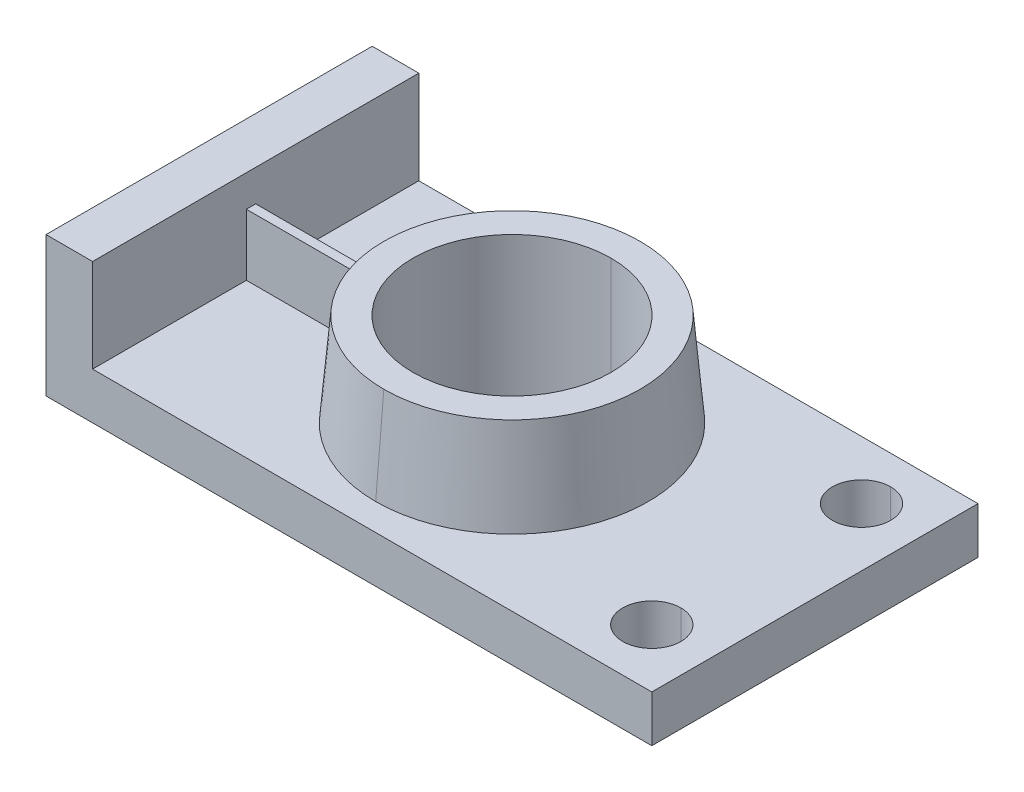
ISO-10303-21;
HEADER;
FILE_DESCRIPTION(('STEP AP214'),'2;1');
FILE_NAME('part.step','',(''),(''),'','','');
FILE_SCHEMA(('AUTOMOTIVE_DESIGN { 1 0 10303 214 1 1 1 1 }'));
ENDSEC;
DATA;
#1=APPLICATION_CONTEXT('core data for automotive mechanical design processes');
#2=APPLICATION_PROTOCOL_DEFINITION('international standard','automotive_design',2000,#1);
#3=PRODUCT_CONTEXT('',#1,'mechanical');
#4=PRODUCT('Part','Part','',(#3));
#5=PRODUCT_RELATED_PRODUCT_CATEGORY('part','',(#4));
#6=PRODUCT_DEFINITION_FORMATION('','',#4);
#7=PRODUCT_DEFINITION_CONTEXT('part definition',#1,'design');
#8=PRODUCT_DEFINITION('design','',#6,#7);
#9=PRODUCT_DEFINITION_SHAPE('','',#8);
#10=(LENGTH_UNIT() NAMED_UNIT(*) SI_UNIT(.MILLI.,.METRE.));
#11=(NAMED_UNIT(*) PLANE_ANGLE_UNIT() SI_UNIT($,.RADIAN.));
#12=(NAMED_UNIT(*) SI_UNIT($,.STERADIAN.) SOLID_ANGLE_UNIT());
#13=UNCERTAINTY_MEASURE_WITH_UNIT(LENGTH_MEASURE(1.E-05),#10,'distance_accuracy_value','');
#14=(GEOMETRIC_REPRESENTATION_CONTEXT(3) GLOBAL_UNCERTAINTY_ASSIGNED_CONTEXT((#13)) GLOBAL_UNIT_ASSIGNED_CONTEXT((#10,
#11,#12)) REPRESENTATION_CONTEXT('',''));
#15=CARTESIAN_POINT('',(0.,0.,0.));
#16=DIRECTION('',(0.,0.,1.));
#17=DIRECTION('',(1.,0.,0.));
#18=AXIS2_PLACEMENT_3D('',#15,#16,#17);
#19=CARTESIAN_POINT('',(149.225,0.,-73.025));
#20=DIRECTION('',(0.,1.,0.));
#21=DIRECTION('',(0.,0.,1.));
#22=AXIS2_PLACEMENT_3D('',#19,#20,#21);
#23=CYLINDRICAL_SURFACE('',#22,7.9375);
#24=DIRECTION('',(0.,1.,0.));
#25=VECTOR('',#24,1.);
#26=CARTESIAN_POINT('',(149.225,0.,-80.9625));
#27=LINE('',#26,#25);
#28=CARTESIAN_POINT('',(149.225,0.,-80.9625));
#29=VERTEX_POINT('',#28);
#30=CARTESIAN_POINT('',(149.225,12.7,-80.9625));
#31=VERTEX_POINT('',#30);
#32=EDGE_CURVE('E47',#29,#31,#27,.T.);
#33=ORIENTED_EDGE('',*,*,#32,.F.);
#34=CARTESIAN_POINT('',(149.225,0.,-73.025));
#35=DIRECTION('',(0.,1.,0.));
#36=DIRECTION('',(0.,0.,1.));
#37=AXIS2_PLACEMENT_3D('',#34,#35,#36);
#38=CIRCLE('',#37,7.9375);
#39=CARTESIAN_POINT('',(149.225,0.,-65.0875));
#40=VERTEX_POINT('',#39);
#41=EDGE_CURVE('E279',#40,#29,#38,.T.);
#42=ORIENTED_EDGE('',*,*,#41,.F.);
#43=DIRECTION('',(0.,1.,0.));
#44=VECTOR('',#43,1.);
#45=CARTESIAN_POINT('',(149.225,0.,-65.0875));
#46=LINE('',#45,#44);
#47=CARTESIAN_POINT('',(149.225,12.7,-65.0875));
#48=VERTEX_POINT('',#47);
#49=EDGE_CURVE('E262',#40,#48,#46,.T.);
#50=ORIENTED_EDGE('',*,*,#49,.T.);
#51=CARTESIAN_POINT('',(149.225,12.7,-73.025));
#52=DIRECTION('',(0.,1.,0.));
#53=DIRECTION('',(0.,0.,1.));
#54=AXIS2_PLACEMENT_3D('',#51,#52,#53);
#55=CIRCLE('',#54,7.9375);
#56=EDGE_CURVE('E311',#48,#31,#55,.T.);
#57=ORIENTED_EDGE('',*,*,#56,.T.);
#58=EDGE_LOOP('',(#33,#42,#50,#57));
#59=FACE_BOUND('',#58,.T.);
#60=ADVANCED_FACE('F43',(#59),#23,.F.);
#61=CARTESIAN_POINT('',(149.225,0.,-15.875));
#62=DIRECTION('',(0.,1.,0.));
#63=DIRECTION('',(0.,0.,1.));
#64=AXIS2_PLACEMENT_3D('',#61,#62,#63);
#65=CYLINDRICAL_SURFACE('',#64,7.9375);
#66=DIRECTION('',(0.,1.,0.));
#67=VECTOR('',#66,1.);
#68=CARTESIAN_POINT('',(149.225,0.,-23.8125));
#69=LINE('',#68,#67);
#70=CARTESIAN_POINT('',(149.225,0.,-23.8125));
#71=VERTEX_POINT('',#70);
#72=CARTESIAN_POINT('',(149.225,12.7,-23.8125));
#73=VERTEX_POINT('',#72);
#74=EDGE_CURVE('E310',#71,#73,#69,.T.);
#75=ORIENTED_EDGE('',*,*,#74,.F.);
#76=CARTESIAN_POINT('',(149.225,0.,-15.875));
#77=DIRECTION('',(0.,1.,0.));
#78=DIRECTION('',(0.,0.,1.));
#79=AXIS2_PLACEMENT_3D('',#76,#77,#78);
#80=CIRCLE('',#79,7.9375);
#81=CARTESIAN_POINT('',(149.225,0.,-7.9375));
#82=VERTEX_POINT('',#81);
#83=EDGE_CURVE('E252',#82,#71,#80,.T.);
#84=ORIENTED_EDGE('',*,*,#83,.F.);
#85=DIRECTION('',(0.,1.,0.));
#86=VECTOR('',#85,1.);
#87=CARTESIAN_POINT('',(149.225,0.,-7.9375));
#88=LINE('',#87,#86);
#89=CARTESIAN_POINT('',(149.225,12.7,-7.9375));
#90=VERTEX_POINT('',#89);
#91=EDGE_CURVE('E309',#82,#90,#88,.T.);
#92=ORIENTED_EDGE('',*,*,#91,.T.);
#93=CARTESIAN_POINT('',(149.225,12.7,-15.875));
#94=DIRECTION('',(0.,1.,0.));
#95=DIRECTION('',(0.,0.,1.));
#96=AXIS2_PLACEMENT_3D('',#93,#94,#95);
#97=CIRCLE('',#96,7.9375);
#98=EDGE_CURVE('E167',#90,#73,#97,.T.);
#99=ORIENTED_EDGE('',*,*,#98,.T.);
#100=EDGE_LOOP('',(#75,#84,#92,#99));
#101=FACE_BOUND('',#100,.T.);
#102=ADVANCED_FACE('F456',(#101),#65,.F.);
#103=CARTESIAN_POINT('',(82.55,0.,-44.45));
#104=DIRECTION('',(0.,1.,0.));
#105=DIRECTION('',(0.,0.,1.));
#106=AXIS2_PLACEMENT_3D('',#103,#104,#105);
#107=CYLINDRICAL_SURFACE('',#106,26.9875);
#108=DIRECTION('',(0.,1.,0.));
#109=VECTOR('',#108,1.);
#110=CARTESIAN_POINT('',(82.55,0.,-71.4375));
#111=LINE('',#110,#109);
#112=CARTESIAN_POINT('',(82.55,0.,-71.4375));
#113=VERTEX_POINT('',#112);
#114=CARTESIAN_POINT('',(82.55,38.1,-71.4375));
#115=VERTEX_POINT('',#114);
#116=EDGE_CURVE('E260',#113,#115,#111,.T.);
#117=ORIENTED_EDGE('',*,*,#116,.F.);
#118=CARTESIAN_POINT('',(82.55,0.,-44.45));
#119=DIRECTION('',(0.,1.,0.));
#120=DIRECTION('',(0.,0.,1.));
#121=AXIS2_PLACEMENT_3D('',#118,#119,#120);
#122=CIRCLE('',#121,26.9875);
#123=CARTESIAN_POINT('',(82.55,0.,-17.4625));
#124=VERTEX_POINT('',#123);
#125=EDGE_CURVE('E248',#124,#113,#122,.T.);
#126=ORIENTED_EDGE('',*,*,#125,.F.);
#127=DIRECTION('',(0.,1.,0.));
#128=VECTOR('',#127,1.);
#129=CARTESIAN_POINT('',(82.55,0.,-17.4625));
#130=LINE('',#129,#128);
#131=CARTESIAN_POINT('',(82.55,38.1,-17.4625));
#132=VERTEX_POINT('',#131);
#133=EDGE_CURVE('E259',#124,#132,#130,.T.);
#134=ORIENTED_EDGE('',*,*,#133,.T.);
#135=CARTESIAN_POINT('',(82.55,38.1,-44.45));
#136=DIRECTION('',(0.,1.,0.));
#137=DIRECTION('',(0.,0.,1.));
#138=AXIS2_PLACEMENT_3D('',#135,#136,#137);
#139=CIRCLE('',#138,26.9875);
#140=EDGE_CURVE('E11',#132,#115,#139,.T.);
#141=ORIENTED_EDGE('',*,*,#140,.T.);
#142=EDGE_LOOP('',(#117,#126,#134,#141));
#143=FACE_BOUND('',#142,.T.);
#144=ADVANCED_FACE('F368',(#143),#107,.F.);
#145=CARTESIAN_POINT('',(82.55,38.1,-44.45));
#146=DIRECTION('',(0.,-1.,0.));
#147=DIRECTION('',(0.,0.,1.));
#148=AXIS2_PLACEMENT_3D('',#145,#146,#147);
#149=CONICAL_SURFACE('',#148,34.925,0.0872664625997163);
#150=CARTESIAN_POINT('',(82.55,12.7,-44.45));
#151=DIRECTION('',(0.,1.,0.));
#152=DIRECTION('',(0.,0.,-1.));
#153=AXIS2_PLACEMENT_3D('',#150,#151,#152);
#154=CIRCLE('',#153,37.1472120535585);
#155=CARTESIAN_POINT('',(82.55,12.7,-7.3027879464416));
#156=VERTEX_POINT('',#155);
#157=CARTESIAN_POINT('',(82.55,12.7,-81.5972120535586));
#158=VERTEX_POINT('',#157);
#159=EDGE_CURVE('E291',#156,#158,#154,.T.);
#160=ORIENTED_EDGE('',*,*,#159,.T.);
#161=DIRECTION('',(0.,-0.996194698091746,-0.0871557427476582));
#162=VECTOR('',#161,1.);
#163=CARTESIAN_POINT('',(82.55,38.1,-79.375));
#164=LINE('',#163,#162);
#165=CARTESIAN_POINT('',(82.55,38.1,-79.375));
#166=VERTEX_POINT('',#165);
#167=EDGE_CURVE('E276',#166,#158,#164,.T.);
#168=ORIENTED_EDGE('',*,*,#167,.F.);
#169=CARTESIAN_POINT('',(82.55,38.1,-44.45));
#170=DIRECTION('',(0.,1.,0.));
#171=DIRECTION('',(0.,0.,1.));
#172=AXIS2_PLACEMENT_3D('',#169,#170,#171);
#173=CIRCLE('',#172,34.925);
#174=CARTESIAN_POINT('',(82.55,38.1,-9.525));
#175=VERTEX_POINT('',#174);
#176=EDGE_CURVE('E53',#175,#166,#173,.T.);
#177=ORIENTED_EDGE('',*,*,#176,.F.);
#178=DIRECTION('',(0.,-0.996194698091746,0.0871557427476582));
#179=VECTOR('',#178,1.);
#180=CARTESIAN_POINT('',(82.55,38.1,-9.525));
#181=LINE('',#180,#179);
#182=EDGE_CURVE('E283',#175,#156,#181,.T.);
#183=ORIENTED_EDGE('',*,*,#182,.T.);
#184=EDGE_LOOP('',(#160,#168,#177,#183));
#185=FACE_BOUND('',#184,.T.);
#186=ADVANCED_FACE('F375',(#185),#149,.T.);
#187=CARTESIAN_POINT('',(82.55,38.1,-44.45));
#188=DIRECTION('',(0.,1.,0.));
#189=DIRECTION('',(1.,0.,0.));
#190=AXIS2_PLACEMENT_3D('',#187,#188,#189);
#191=PLANE('',#190);
#192=ORIENTED_EDGE('',*,*,#140,.F.);
#193=CARTESIAN_POINT('',(82.55,38.1,-44.45));
#194=DIRECTION('',(0.,1.,0.));
#195=DIRECTION('',(0.,0.,1.));
#196=AXIS2_PLACEMENT_3D('',#193,#194,#195);
#197=CIRCLE('',#196,26.9875);
#198=EDGE_CURVE('E256',#115,#132,#197,.T.);
#199=ORIENTED_EDGE('',*,*,#198,.F.);
#200=EDGE_LOOP('',(#192,#199));
#201=FACE_BOUND('',#200,.T.);
#202=ORIENTED_EDGE('',*,*,#176,.T.);
#203=CARTESIAN_POINT('',(82.55,38.1,-44.45));
#204=DIRECTION('',(0.,1.,0.));
#205=DIRECTION('',(0.,0.,1.));
#206=AXIS2_PLACEMENT_3D('',#203,#204,#205);
#207=CIRCLE('',#206,34.925);
#208=EDGE_CURVE('E272',#166,#175,#207,.T.);
#209=ORIENTED_EDGE('',*,*,#208,.T.);
#210=EDGE_LOOP('',(#202,#209));
#211=FACE_BOUND('',#210,.T.);
#212=ADVANCED_FACE('F372',(#201,#211),#191,.T.);
#213=CARTESIAN_POINT('',(165.1,0.,0.));
#214=DIRECTION('',(0.,0.,-1.));
#215=DIRECTION('',(0.,-1.,0.));
#216=AXIS2_PLACEMENT_3D('',#213,#214,#215);
#217=PLANE('',#216);
#218=DIRECTION('',(1.,0.,0.));
#219=VECTOR('',#218,1.);
#220=CARTESIAN_POINT('',(0.,0.,0.));
#221=LINE('',#220,#219);
#222=CARTESIAN_POINT('',(0.,0.,0.));
#223=VERTEX_POINT('',#222);
#224=CARTESIAN_POINT('',(165.1,0.,0.));
#225=VERTEX_POINT('',#224);
#226=EDGE_CURVE('E280',#223,#225,#221,.T.);
#227=ORIENTED_EDGE('',*,*,#226,.T.);
#228=DIRECTION('',(0.,-1.,0.));
#229=VECTOR('',#228,1.);
#230=CARTESIAN_POINT('',(165.1,12.7,0.));
#231=LINE('',#230,#229);
#232=CARTESIAN_POINT('',(165.1,12.7,0.));
#233=VERTEX_POINT('',#232);
#234=EDGE_CURVE('E219',#233,#225,#231,.T.);
#235=ORIENTED_EDGE('',*,*,#234,.F.);
#236=DIRECTION('',(1.,0.,0.));
#237=VECTOR('',#236,1.);
#238=CARTESIAN_POINT('',(0.,12.7,0.));
#239=LINE('',#238,#237);
#240=CARTESIAN_POINT('',(12.7,12.7,0.));
#241=VERTEX_POINT('',#240);
#242=EDGE_CURVE('E202',#241,#233,#239,.T.);
#243=ORIENTED_EDGE('',*,*,#242,.F.);
#244=DIRECTION('',(0.,-1.,0.));
#245=VECTOR('',#244,1.);
#246=CARTESIAN_POINT('',(12.7,38.1,0.));
#247=LINE('',#246,#245);
#248=CARTESIAN_POINT('',(12.7,38.1,0.));
#249=VERTEX_POINT('',#248);
#250=EDGE_CURVE('E211',#249,#241,#247,.T.);
#251=ORIENTED_EDGE('',*,*,#250,.F.);
#252=DIRECTION('',(1.,0.,0.));
#253=VECTOR('',#252,1.);
#254=CARTESIAN_POINT('',(0.,38.1,0.));
#255=LINE('',#254,#253);
#256=CARTESIAN_POINT('',(0.,38.1,0.));
#257=VERTEX_POINT('',#256);
#258=EDGE_CURVE('E320',#257,#249,#255,.T.);
#259=ORIENTED_EDGE('',*,*,#258,.F.);
#260=DIRECTION('',(0.,-1.,0.));
#261=VECTOR('',#260,1.);
#262=CARTESIAN_POINT('',(0.,38.1,0.));
#263=LINE('',#262,#261);
#264=EDGE_CURVE('E251',#257,#223,#263,.T.);
#265=ORIENTED_EDGE('',*,*,#264,.T.);
#266=EDGE_LOOP('',(#227,#235,#243,#251,#259,#265));
#267=FACE_BOUND('',#266,.T.);
#268=ADVANCED_FACE('F216',(#267),#217,.F.);
#269=CARTESIAN_POINT('',(165.1,0.,-88.9));
#270=DIRECTION('',(0.,0.,-1.));
#271=DIRECTION('',(0.,-1.,0.));
#272=AXIS2_PLACEMENT_3D('',#269,#270,#271);
#273=PLANE('',#272);
#274=DIRECTION('',(1.,0.,0.));
#275=VECTOR('',#274,1.);
#276=CARTESIAN_POINT('',(0.,0.,-88.9));
#277=LINE('',#276,#275);
#278=CARTESIAN_POINT('',(0.,0.,-88.9));
#279=VERTEX_POINT('',#278);
#280=CARTESIAN_POINT('',(165.1,0.,-88.9));
#281=VERTEX_POINT('',#280);
#282=EDGE_CURVE('E242',#279,#281,#277,.T.);
#283=ORIENTED_EDGE('',*,*,#282,.F.);
#284=DIRECTION('',(0.,-1.,0.));
#285=VECTOR('',#284,1.);
#286=CARTESIAN_POINT('',(0.,38.1,-88.9));
#287=LINE('',#286,#285);
#288=CARTESIAN_POINT('',(0.,38.1,-88.9));
#289=VERTEX_POINT('',#288);
#290=EDGE_CURVE('E288',#289,#279,#287,.T.);
#291=ORIENTED_EDGE('',*,*,#290,.F.);
#292=DIRECTION('',(1.,0.,0.));
#293=VECTOR('',#292,1.);
#294=CARTESIAN_POINT('',(0.,38.1,-88.9));
#295=LINE('',#294,#293);
#296=CARTESIAN_POINT('',(12.7,38.1,-88.9));
#297=VERTEX_POINT('',#296);
#298=EDGE_CURVE('E229',#289,#297,#295,.T.);
#299=ORIENTED_EDGE('',*,*,#298,.T.);
#300=DIRECTION('',(0.,-1.,0.));
#301=VECTOR('',#300,1.);
#302=CARTESIAN_POINT('',(12.7,38.1,-88.9));
#303=LINE('',#302,#301);
#304=CARTESIAN_POINT('',(12.7,12.7,-88.9));
#305=VERTEX_POINT('',#304);
#306=EDGE_CURVE('E222',#297,#305,#303,.T.);
#307=ORIENTED_EDGE('',*,*,#306,.T.);
#308=DIRECTION('',(1.,0.,0.));
#309=VECTOR('',#308,1.);
#310=CARTESIAN_POINT('',(0.,12.7,-88.9));
#311=LINE('',#310,#309);
#312=CARTESIAN_POINT('',(165.1,12.7,-88.9));
#313=VERTEX_POINT('',#312);
#314=EDGE_CURVE('E300',#305,#313,#311,.T.);
#315=ORIENTED_EDGE('',*,*,#314,.T.);
#316=DIRECTION('',(0.,-1.,0.));
#317=VECTOR('',#316,1.);
#318=CARTESIAN_POINT('',(165.1,12.7,-88.9));
#319=LINE('',#318,#317);
#320=EDGE_CURVE('E75',#313,#281,#319,.T.);
#321=ORIENTED_EDGE('',*,*,#320,.T.);
#322=EDGE_LOOP('',(#283,#291,#299,#307,#315,#321));
#323=FACE_BOUND('',#322,.T.);
#324=ADVANCED_FACE('F461',(#323),#273,.T.);
#325=CARTESIAN_POINT('',(165.1,12.7,-88.9));
#326=DIRECTION('',(-1.,0.,0.));
#327=DIRECTION('',(0.,0.,1.));
#328=AXIS2_PLACEMENT_3D('',#325,#326,#327);
#329=PLANE('',#328);
#330=ORIENTED_EDGE('',*,*,#234,.T.);
#331=DIRECTION('',(0.,0.,1.));
#332=VECTOR('',#331,1.);
#333=CARTESIAN_POINT('',(165.1,0.,-88.9));
#334=LINE('',#333,#332);
#335=EDGE_CURVE('E246',#281,#225,#334,.T.);
#336=ORIENTED_EDGE('',*,*,#335,.F.);
#337=ORIENTED_EDGE('',*,*,#320,.F.);
#338=DIRECTION('',(0.,0.,1.));
#339=VECTOR('',#338,1.);
#340=CARTESIAN_POINT('',(165.1,12.7,-88.9));
#341=LINE('',#340,#339);
#342=EDGE_CURVE('E221',#313,#233,#341,.T.);
#343=ORIENTED_EDGE('',*,*,#342,.T.);
#344=EDGE_LOOP('',(#330,#336,#337,#343));
#345=FACE_BOUND('',#344,.T.);
#346=ADVANCED_FACE('F459',(#345),#329,.F.);
#347=CARTESIAN_POINT('',(0.,12.7,-88.9));
#348=DIRECTION('',(0.,-1.,0.));
#349=DIRECTION('',(0.,0.,-1.));
#350=AXIS2_PLACEMENT_3D('',#347,#348,#349);
#351=PLANE('',#350);
#352=ORIENTED_EDGE('',*,*,#242,.T.);
#353=ORIENTED_EDGE('',*,*,#342,.F.);
#354=ORIENTED_EDGE('',*,*,#314,.F.);
#355=DIRECTION('',(0.,0.,1.));
#356=VECTOR('',#355,1.);
#357=CARTESIAN_POINT('',(12.7,12.7,-88.9));
#358=LINE('',#357,#356);
#359=CARTESIAN_POINT('',(12.7,12.7,-44.45));
#360=VERTEX_POINT('',#359);
#361=EDGE_CURVE('E210',#305,#360,#358,.T.);
#362=ORIENTED_EDGE('',*,*,#361,.T.);
#363=DIRECTION('',(-1.,0.,0.));
#364=VECTOR('',#363,1.);
#365=CARTESIAN_POINT('',(0.,12.7,-44.45));
#366=LINE('',#365,#364);
#367=CARTESIAN_POINT('',(45.4027879464415,12.7,-44.45));
#368=VERTEX_POINT('',#367);
#369=EDGE_CURVE('E394',#368,#360,#366,.T.);
#370=ORIENTED_EDGE('',*,*,#369,.F.);
#371=CARTESIAN_POINT('',(82.55,12.7,-44.45));
#372=DIRECTION('',(0.,1.,0.));
#373=DIRECTION('',(0.,0.,-1.));
#374=AXIS2_PLACEMENT_3D('',#371,#372,#373);
#375=CIRCLE('',#374,37.1472120535585);
#376=EDGE_CURVE('E301',#158,#368,#375,.T.);
#377=ORIENTED_EDGE('',*,*,#376,.F.);
#378=ORIENTED_EDGE('',*,*,#159,.F.);
#379=CARTESIAN_POINT('',(45.4897279644086,12.7,-41.91));
#380=VERTEX_POINT('',#379);
#381=EDGE_CURVE('E297',#380,#156,#375,.T.);
#382=ORIENTED_EDGE('',*,*,#381,.F.);
#383=DIRECTION('',(-1.,0.,0.));
#384=VECTOR('',#383,1.);
#385=CARTESIAN_POINT('',(0.,12.7,-41.91));
#386=LINE('',#385,#384);
#387=CARTESIAN_POINT('',(12.7,12.7,-41.91));
#388=VERTEX_POINT('',#387);
#389=EDGE_CURVE('E205',#380,#388,#386,.T.);
#390=ORIENTED_EDGE('',*,*,#389,.T.);
#391=EDGE_CURVE('E198',#388,#241,#358,.T.);
#392=ORIENTED_EDGE('',*,*,#391,.T.);
#393=EDGE_LOOP('',(#352,#353,#354,#362,#370,#377,#378,#382,#390,#392));
#394=FACE_BOUND('',#393,.T.);
#395=ORIENTED_EDGE('',*,*,#98,.F.);
#396=CARTESIAN_POINT('',(149.225,12.7,-15.875));
#397=DIRECTION('',(0.,1.,0.));
#398=DIRECTION('',(0.,0.,1.));
#399=AXIS2_PLACEMENT_3D('',#396,#397,#398);
#400=CIRCLE('',#399,7.9375);
#401=EDGE_CURVE('E305',#73,#90,#400,.T.);
#402=ORIENTED_EDGE('',*,*,#401,.F.);
#403=EDGE_LOOP('',(#395,#402));
#404=FACE_BOUND('',#403,.T.);
#405=ORIENTED_EDGE('',*,*,#56,.F.);
#406=CARTESIAN_POINT('',(149.225,12.7,-73.025));
#407=DIRECTION('',(0.,1.,0.));
#408=DIRECTION('',(0.,0.,1.));
#409=AXIS2_PLACEMENT_3D('',#406,#407,#408);
#410=CIRCLE('',#409,7.9375);
#411=EDGE_CURVE('E267',#31,#48,#410,.T.);
#412=ORIENTED_EDGE('',*,*,#411,.F.);
#413=EDGE_LOOP('',(#405,#412));
#414=FACE_BOUND('',#413,.T.);
#415=ADVANCED_FACE('F200',(#394,#404,#414),#351,.F.);
#416=CARTESIAN_POINT('',(12.7,38.1,-88.9));
#417=DIRECTION('',(-1.,0.,0.));
#418=DIRECTION('',(0.,0.,1.));
#419=AXIS2_PLACEMENT_3D('',#416,#417,#418);
#420=PLANE('',#419);
#421=ORIENTED_EDGE('',*,*,#391,.F.);
#422=DIRECTION('',(0.,1.,0.));
#423=VECTOR('',#422,1.);
#424=CARTESIAN_POINT('',(12.7,38.1,-41.91));
#425=LINE('',#424,#423);
#426=CARTESIAN_POINT('',(12.7,29.4719825161796,-41.91));
#427=VERTEX_POINT('',#426);
#428=EDGE_CURVE('E410',#388,#427,#425,.T.);
#429=ORIENTED_EDGE('',*,*,#428,.T.);
#430=DIRECTION('',(0.,0.,1.));
#431=VECTOR('',#430,1.);
#432=CARTESIAN_POINT('',(12.7,29.4719825161796,-88.9));
#433=LINE('',#432,#431);
#434=CARTESIAN_POINT('',(12.7,29.4719825161796,-44.45));
#435=VERTEX_POINT('',#434);
#436=EDGE_CURVE('E237',#427,#435,#433,.F.);
#437=ORIENTED_EDGE('',*,*,#436,.T.);
#438=DIRECTION('',(0.,1.,0.));
#439=VECTOR('',#438,1.);
#440=CARTESIAN_POINT('',(12.7,38.1,-44.45));
#441=LINE('',#440,#439);
#442=EDGE_CURVE('E430',#360,#435,#441,.T.);
#443=ORIENTED_EDGE('',*,*,#442,.F.);
#444=ORIENTED_EDGE('',*,*,#361,.F.);
#445=ORIENTED_EDGE('',*,*,#306,.F.);
#446=DIRECTION('',(0.,0.,1.));
#447=VECTOR('',#446,1.);
#448=CARTESIAN_POINT('',(12.7,38.1,-88.9));
#449=LINE('',#448,#447);
#450=EDGE_CURVE('E226',#297,#249,#449,.T.);
#451=ORIENTED_EDGE('',*,*,#450,.T.);
#452=ORIENTED_EDGE('',*,*,#250,.T.);
#453=EDGE_LOOP('',(#421,#429,#437,#443,#444,#445,#451,#452));
#454=FACE_BOUND('',#453,.T.);
#455=ADVANCED_FACE('F224',(#454),#420,.F.);
#456=CARTESIAN_POINT('',(0.,38.1,-88.9));
#457=DIRECTION('',(0.,-1.,0.));
#458=DIRECTION('',(0.,0.,-1.));
#459=AXIS2_PLACEMENT_3D('',#456,#457,#458);
#460=PLANE('',#459);
#461=ORIENTED_EDGE('',*,*,#258,.T.);
#462=ORIENTED_EDGE('',*,*,#450,.F.);
#463=ORIENTED_EDGE('',*,*,#298,.F.);
#464=DIRECTION('',(0.,0.,1.));
#465=VECTOR('',#464,1.);
#466=CARTESIAN_POINT('',(0.,38.1,-88.9));
#467=LINE('',#466,#465);
#468=EDGE_CURVE('E284',#289,#257,#467,.T.);
#469=ORIENTED_EDGE('',*,*,#468,.T.);
#470=EDGE_LOOP('',(#461,#462,#463,#469));
#471=FACE_BOUND('',#470,.T.);
#472=ADVANCED_FACE('F449',(#471),#460,.F.);
#473=CARTESIAN_POINT('',(0.,38.1,-88.9));
#474=DIRECTION('',(-1.,0.,0.));
#475=DIRECTION('',(0.,0.,1.));
#476=AXIS2_PLACEMENT_3D('',#473,#474,#475);
#477=PLANE('',#476);
#478=DIRECTION('',(0.,0.,1.));
#479=VECTOR('',#478,1.);
#480=CARTESIAN_POINT('',(0.,0.,-88.9));
#481=LINE('',#480,#479);
#482=EDGE_CURVE('E247',#279,#223,#481,.T.);
#483=ORIENTED_EDGE('',*,*,#482,.T.);
#484=ORIENTED_EDGE('',*,*,#264,.F.);
#485=ORIENTED_EDGE('',*,*,#468,.F.);
#486=ORIENTED_EDGE('',*,*,#290,.T.);
#487=EDGE_LOOP('',(#483,#484,#485,#486));
#488=FACE_BOUND('',#487,.T.);
#489=ADVANCED_FACE('F452',(#488),#477,.T.);
#490=CARTESIAN_POINT('',(0.,0.,-88.9));
#491=DIRECTION('',(0.,-1.,0.));
#492=DIRECTION('',(0.,0.,-1.));
#493=AXIS2_PLACEMENT_3D('',#490,#491,#492);
#494=PLANE('',#493);
#495=ORIENTED_EDGE('',*,*,#125,.T.);
#496=CARTESIAN_POINT('',(82.55,0.,-44.45));
#497=DIRECTION('',(0.,1.,0.));
#498=DIRECTION('',(0.,0.,1.));
#499=AXIS2_PLACEMENT_3D('',#496,#497,#498);
#500=CIRCLE('',#499,26.9875);
#501=EDGE_CURVE('E333',#113,#124,#500,.T.);
#502=ORIENTED_EDGE('',*,*,#501,.T.);
#503=EDGE_LOOP('',(#495,#502));
#504=FACE_BOUND('',#503,.T.);
#505=ORIENTED_EDGE('',*,*,#335,.T.);
#506=ORIENTED_EDGE('',*,*,#226,.F.);
#507=ORIENTED_EDGE('',*,*,#482,.F.);
#508=ORIENTED_EDGE('',*,*,#282,.T.);
#509=EDGE_LOOP('',(#505,#506,#507,#508));
#510=FACE_BOUND('',#509,.T.);
#511=ORIENTED_EDGE('',*,*,#83,.T.);
#512=CARTESIAN_POINT('',(149.225,0.,-15.875));
#513=DIRECTION('',(0.,1.,0.));
#514=DIRECTION('',(0.,0.,1.));
#515=AXIS2_PLACEMENT_3D('',#512,#513,#514);
#516=CIRCLE('',#515,7.9375);
#517=EDGE_CURVE('E266',#71,#82,#516,.T.);
#518=ORIENTED_EDGE('',*,*,#517,.T.);
#519=EDGE_LOOP('',(#511,#518));
#520=FACE_BOUND('',#519,.T.);
#521=ORIENTED_EDGE('',*,*,#41,.T.);
#522=CARTESIAN_POINT('',(149.225,0.,-73.025));
#523=DIRECTION('',(0.,1.,0.));
#524=DIRECTION('',(0.,0.,1.));
#525=AXIS2_PLACEMENT_3D('',#522,#523,#524);
#526=CIRCLE('',#525,7.9375);
#527=EDGE_CURVE('E268',#29,#40,#526,.T.);
#528=ORIENTED_EDGE('',*,*,#527,.T.);
#529=EDGE_LOOP('',(#521,#528));
#530=FACE_BOUND('',#529,.T.);
#531=ADVANCED_FACE('F45',(#504,#510,#520,#530),#494,.T.);
#532=CARTESIAN_POINT('',(82.55,38.1,-44.45));
#533=DIRECTION('',(0.,-1.,0.));
#534=DIRECTION('',(0.,0.,1.));
#535=AXIS2_PLACEMENT_3D('',#532,#533,#534);
#536=CONICAL_SURFACE('',#535,34.925,0.0872664625997163);
#537=CARTESIAN_POINT('',(39.985207701471,-50.0886895917063,-41.91));
#538=CARTESIAN_POINT('',(40.9689682985779,-38.8642554934437,-41.91));
#539=CARTESIAN_POINT('',(41.9528431323834,-27.6398314058211,-41.91));
#540=CARTESIAN_POINT('',(43.9208924373459,-5.1910095130417,-41.91));
#541=CARTESIAN_POINT('',(44.9050669085027,6.03338829211526,-41.91));
#542=CARTESIAN_POINT('',(46.8737866549775,28.4821513913598,-41.91));
#543=CARTESIAN_POINT('',(47.8583319302959,39.7065166854474,-41.91));
#544=CARTESIAN_POINT('',(49.8279098781523,62.1552045236253,-41.91));
#545=CARTESIAN_POINT('',(50.8129425506909,73.3795270677157,-41.91));
#546=CARTESIAN_POINT('',(51.798277217445,84.6038231068142,-41.91));
#547=B_SPLINE_CURVE_WITH_KNOTS('',3,(#537,#538,#539,#540,#541,#542,#543,#544,#545,#546),
.UNSPECIFIED.,.F.,.F.,(4,2,2,2,4),(0.,33.8023867760212,67.6047735118188,101.407160265289,
135.209547059304),.UNSPECIFIED.);
#548=CARTESIAN_POINT('',(46.9606706809997,29.4719825161796,-41.91));
#549=VERTEX_POINT('',#548);
#550=EDGE_CURVE('E389',#380,#549,#547,.T.);
#551=ORIENTED_EDGE('',*,*,#550,.F.);
#552=ORIENTED_EDGE('',*,*,#381,.T.);
#553=ORIENTED_EDGE('',*,*,#182,.F.);
#554=ORIENTED_EDGE('',*,*,#208,.F.);
#555=ORIENTED_EDGE('',*,*,#167,.T.);
#556=ORIENTED_EDGE('',*,*,#376,.T.);
#557=DIRECTION('',(-0.087155742747658,-0.996194698091746,0.));
#558=VECTOR('',#557,1.);
#559=CARTESIAN_POINT('',(82.55,437.294576673941,-44.45));
#560=LINE('',#559,#558);
#561=CARTESIAN_POINT('',(46.8701462814622,29.4719825161795,-44.45));
#562=VERTEX_POINT('',#561);
#563=EDGE_CURVE('E396',#368,#562,#560,.F.);
#564=ORIENTED_EDGE('',*,*,#563,.T.);
#565=CARTESIAN_POINT('',(82.55,29.4719825161796,-44.45));
#566=DIRECTION('',(0.,-1.,0.));
#567=DIRECTION('',(0.,0.,-1.));
#568=AXIS2_PLACEMENT_3D('',#565,#566,#567);
#569=CIRCLE('',#568,35.6798537185377);
#570=EDGE_CURVE('E416',#549,#562,#569,.T.);
#571=ORIENTED_EDGE('',*,*,#570,.F.);
#572=EDGE_LOOP('',(#551,#552,#553,#554,#555,#556,#564,#571));
#573=FACE_BOUND('',#572,.T.);
#574=ADVANCED_FACE('F385',(#573),#536,.T.);
#575=CARTESIAN_POINT('',(82.55,0.,-44.45));
#576=DIRECTION('',(0.,1.,0.));
#577=DIRECTION('',(0.,0.,1.));
#578=AXIS2_PLACEMENT_3D('',#575,#576,#577);
#579=CYLINDRICAL_SURFACE('',#578,26.9875);
#580=ORIENTED_EDGE('',*,*,#133,.F.);
#581=ORIENTED_EDGE('',*,*,#501,.F.);
#582=ORIENTED_EDGE('',*,*,#116,.T.);
#583=ORIENTED_EDGE('',*,*,#198,.T.);
#584=EDGE_LOOP('',(#580,#581,#582,#583));
#585=FACE_BOUND('',#584,.T.);
#586=ADVANCED_FACE('F369',(#585),#579,.F.);
#587=CARTESIAN_POINT('',(149.225,0.,-15.875));
#588=DIRECTION('',(0.,1.,0.));
#589=DIRECTION('',(0.,0.,1.));
#590=AXIS2_PLACEMENT_3D('',#587,#588,#589);
#591=CYLINDRICAL_SURFACE('',#590,7.9375);
#592=ORIENTED_EDGE('',*,*,#517,.F.);
#593=ORIENTED_EDGE('',*,*,#74,.T.);
#594=ORIENTED_EDGE('',*,*,#401,.T.);
#595=ORIENTED_EDGE('',*,*,#91,.F.);
#596=EDGE_LOOP('',(#592,#593,#594,#595));
#597=FACE_BOUND('',#596,.T.);
#598=ADVANCED_FACE('F448',(#597),#591,.F.);
#599=CARTESIAN_POINT('',(149.225,0.,-73.025));
#600=DIRECTION('',(0.,1.,0.));
#601=DIRECTION('',(0.,0.,1.));
#602=AXIS2_PLACEMENT_3D('',#599,#600,#601);
#603=CYLINDRICAL_SURFACE('',#602,7.9375);
#604=ORIENTED_EDGE('',*,*,#527,.F.);
#605=ORIENTED_EDGE('',*,*,#32,.T.);
#606=ORIENTED_EDGE('',*,*,#411,.T.);
#607=ORIENTED_EDGE('',*,*,#49,.F.);
#608=EDGE_LOOP('',(#604,#605,#606,#607));
#609=FACE_BOUND('',#608,.T.);
#610=ADVANCED_FACE('F444',(#609),#603,.F.);
#611=CARTESIAN_POINT('',(12.7,29.4719825161796,-43.18));
#612=DIRECTION('',(0.,-1.,0.));
#613=DIRECTION('',(1.,0.,0.));
#614=AXIS2_PLACEMENT_3D('',#611,#612,#613);
#615=PLANE('',#614);
#616=ORIENTED_EDGE('',*,*,#436,.F.);
#617=DIRECTION('',(1.,0.,0.));
#618=VECTOR('',#617,1.);
#619=CARTESIAN_POINT('',(82.55,29.4719825161796,-41.91));
#620=LINE('',#619,#618);
#621=EDGE_CURVE('E413',#427,#549,#620,.T.);
#622=ORIENTED_EDGE('',*,*,#621,.T.);
#623=ORIENTED_EDGE('',*,*,#570,.T.);
#624=DIRECTION('',(1.,0.,0.));
#625=VECTOR('',#624,1.);
#626=CARTESIAN_POINT('',(82.55,29.4719825161796,-44.45));
#627=LINE('',#626,#625);
#628=EDGE_CURVE('E61',#435,#562,#627,.T.);
#629=ORIENTED_EDGE('',*,*,#628,.F.);
#630=EDGE_LOOP('',(#616,#622,#623,#629));
#631=FACE_BOUND('',#630,.T.);
#632=ADVANCED_FACE('F439',(#631),#615,.F.);
#633=CARTESIAN_POINT('',(82.55,19.05,-41.91));
#634=DIRECTION('',(0.,0.,1.));
#635=DIRECTION('',(1.,0.,0.));
#636=AXIS2_PLACEMENT_3D('',#633,#634,#635);
#637=PLANE('',#636);
#638=ORIENTED_EDGE('',*,*,#428,.F.);
#639=ORIENTED_EDGE('',*,*,#389,.F.);
#640=ORIENTED_EDGE('',*,*,#550,.T.);
#641=ORIENTED_EDGE('',*,*,#621,.F.);
#642=EDGE_LOOP('',(#638,#639,#640,#641));
#643=FACE_BOUND('',#642,.T.);
#644=ADVANCED_FACE('F411',(#643),#637,.T.);
#645=CARTESIAN_POINT('',(82.55,19.05,-44.45));
#646=DIRECTION('',(0.,0.,1.));
#647=DIRECTION('',(1.,0.,0.));
#648=AXIS2_PLACEMENT_3D('',#645,#646,#647);
#649=PLANE('',#648);
#650=ORIENTED_EDGE('',*,*,#369,.T.);
#651=ORIENTED_EDGE('',*,*,#442,.T.);
#652=ORIENTED_EDGE('',*,*,#628,.T.);
#653=ORIENTED_EDGE('',*,*,#563,.F.);
#654=EDGE_LOOP('',(#650,#651,#652,#653));
#655=FACE_BOUND('',#654,.T.);
#656=ADVANCED_FACE('F438',(#655),#649,.F.);
#657=CLOSED_SHELL('',(#60,#102,#144,#186,#212,#268,#324,#346,#415,#455,#472,#489,#531,#574,#586,
#598,#610,#632,#644,#656));
#658=MANIFOLD_SOLID_BREP('B2',#657);
#659=ADVANCED_BREP_SHAPE_REPRESENTATION('',(#18,#658),#14);
#660=SHAPE_DEFINITION_REPRESENTATION(#9,#659);
ENDSEC;
END-ISO-10303-21;
